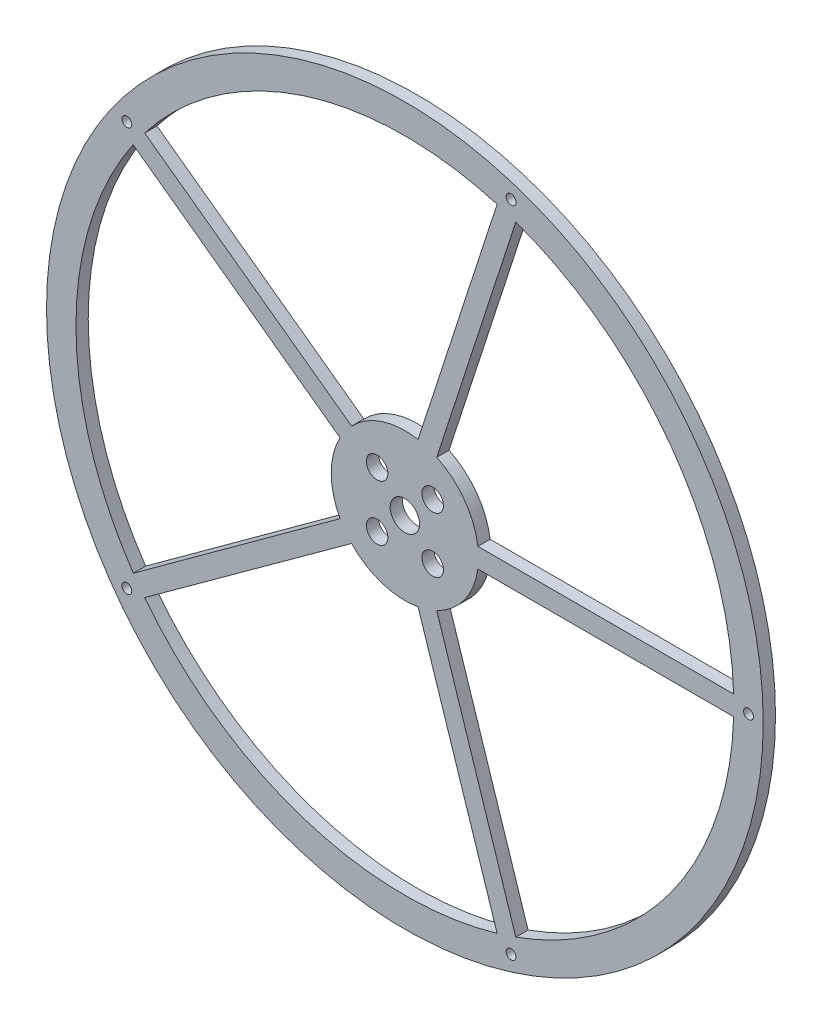
ISO-10303-21;
HEADER;
FILE_DESCRIPTION(('STEP AP214'),'2;1');
FILE_NAME('part.step','',(''),(''),'','','');
FILE_SCHEMA(('AUTOMOTIVE_DESIGN { 1 0 10303 214 1 1 1 1 }'));
ENDSEC;
DATA;
#1=APPLICATION_CONTEXT('core data for automotive mechanical design processes');
#2=APPLICATION_PROTOCOL_DEFINITION('international standard','automotive_design',2000,#1);
#3=PRODUCT_CONTEXT('',#1,'mechanical');
#4=PRODUCT('Part','Part','',(#3));
#5=PRODUCT_RELATED_PRODUCT_CATEGORY('part','',(#4));
#6=PRODUCT_DEFINITION_FORMATION('','',#4);
#7=PRODUCT_DEFINITION_CONTEXT('part definition',#1,'design');
#8=PRODUCT_DEFINITION('design','',#6,#7);
#9=PRODUCT_DEFINITION_SHAPE('','',#8);
#10=(LENGTH_UNIT() NAMED_UNIT(*) SI_UNIT(.MILLI.,.METRE.));
#11=(NAMED_UNIT(*) PLANE_ANGLE_UNIT() SI_UNIT($,.RADIAN.));
#12=(NAMED_UNIT(*) SI_UNIT($,.STERADIAN.) SOLID_ANGLE_UNIT());
#13=UNCERTAINTY_MEASURE_WITH_UNIT(LENGTH_MEASURE(1.E-05),#10,'distance_accuracy_value','');
#14=(GEOMETRIC_REPRESENTATION_CONTEXT(3) GLOBAL_UNCERTAINTY_ASSIGNED_CONTEXT((#13)) GLOBAL_UNIT_ASSIGNED_CONTEXT((#10,
#11,#12)) REPRESENTATION_CONTEXT('',''));
#15=CARTESIAN_POINT('',(0.,0.,0.));
#16=DIRECTION('',(0.,0.,1.));
#17=DIRECTION('',(1.,0.,0.));
#18=AXIS2_PLACEMENT_3D('',#15,#16,#17);
#19=CARTESIAN_POINT('',(0.,0.,0.));
#20=DIRECTION('',(0.,0.,1.));
#21=DIRECTION('',(1.,0.,0.));
#22=AXIS2_PLACEMENT_3D('',#19,#20,#21);
#23=CYLINDRICAL_SURFACE('',#22,67.);
#24=CARTESIAN_POINT('',(0.,0.,0.));
#25=DIRECTION('',(0.,0.,1.));
#26=DIRECTION('',(1.,0.,0.));
#27=AXIS2_PLACEMENT_3D('',#24,#25,#26);
#28=CIRCLE('',#27,67.);
#29=CARTESIAN_POINT('',(22.5970252120168,-63.0743565291591,0.));
#30=VERTEX_POINT('',#29);
#31=CARTESIAN_POINT('',(66.9701426010129,-2.,0.));
#32=VERTEX_POINT('',#31);
#33=EDGE_CURVE('E202',#30,#32,#28,.T.);
#34=ORIENTED_EDGE('',*,*,#33,.F.);
#35=DIRECTION('',(0.,0.,1.));
#36=VECTOR('',#35,1.);
#37=CARTESIAN_POINT('',(22.5970252120168,-63.0743565291591,0.));
#38=LINE('',#37,#36);
#39=CARTESIAN_POINT('',(22.5970252120168,-63.0743565291591,2.5));
#40=VERTEX_POINT('',#39);
#41=EDGE_CURVE('E195',#30,#40,#38,.T.);
#42=ORIENTED_EDGE('',*,*,#41,.T.);
#43=CARTESIAN_POINT('',(0.,0.,2.5));
#44=DIRECTION('',(0.,0.,1.));
#45=DIRECTION('',(1.,0.,0.));
#46=AXIS2_PLACEMENT_3D('',#43,#44,#45);
#47=CIRCLE('',#46,67.);
#48=CARTESIAN_POINT('',(66.9701426010129,-2.,2.5));
#49=VERTEX_POINT('',#48);
#50=EDGE_CURVE('E217',#40,#49,#47,.T.);
#51=ORIENTED_EDGE('',*,*,#50,.T.);
#52=DIRECTION('',(0.,0.,1.));
#53=VECTOR('',#52,1.);
#54=CARTESIAN_POINT('',(66.9701426010129,-2.,0.));
#55=LINE('',#54,#53);
#56=EDGE_CURVE('E212',#32,#49,#55,.T.);
#57=ORIENTED_EDGE('',*,*,#56,.F.);
#58=EDGE_LOOP('',(#34,#42,#51,#57));
#59=FACE_BOUND('',#58,.T.);
#60=ADVANCED_FACE('F39',(#59),#23,.F.);
#61=CARTESIAN_POINT('',(0.,0.,0.));
#62=DIRECTION('',(0.,0.,1.));
#63=DIRECTION('',(1.,0.,0.));
#64=AXIS2_PLACEMENT_3D('',#61,#62,#63);
#65=CYLINDRICAL_SURFACE('',#64,15.);
#66=DIRECTION('',(0.,0.,1.));
#67=VECTOR('',#66,1.);
#68=CARTESIAN_POINT('',(6.49598091505798,-13.5204375650791,0.));
#69=LINE('',#68,#67);
#70=CARTESIAN_POINT('',(6.49598091505798,-13.5204375650791,0.));
#71=VERTEX_POINT('',#70);
#72=CARTESIAN_POINT('',(6.49598091505798,-13.5204375650791,2.5));
#73=VERTEX_POINT('',#72);
#74=EDGE_CURVE('E369',#71,#73,#69,.T.);
#75=ORIENTED_EDGE('',*,*,#74,.F.);
#76=CARTESIAN_POINT('',(0.,0.,0.));
#77=DIRECTION('',(0.,0.,1.));
#78=DIRECTION('',(1.,0.,0.));
#79=AXIS2_PLACEMENT_3D('',#76,#77,#78);
#80=CIRCLE('',#79,15.);
#81=CARTESIAN_POINT('',(14.8660687473185,-2.,0.));
#82=VERTEX_POINT('',#81);
#83=EDGE_CURVE('E314',#71,#82,#80,.T.);
#84=ORIENTED_EDGE('',*,*,#83,.T.);
#85=DIRECTION('',(0.,0.,1.));
#86=VECTOR('',#85,1.);
#87=CARTESIAN_POINT('',(14.8660687473185,-2.,0.));
#88=LINE('',#87,#86);
#89=CARTESIAN_POINT('',(14.8660687473185,-2.,2.5));
#90=VERTEX_POINT('',#89);
#91=EDGE_CURVE('E11',#82,#90,#88,.T.);
#92=ORIENTED_EDGE('',*,*,#91,.T.);
#93=CARTESIAN_POINT('',(0.,0.,2.5));
#94=DIRECTION('',(0.,0.,1.));
#95=DIRECTION('',(1.,0.,0.));
#96=AXIS2_PLACEMENT_3D('',#93,#94,#95);
#97=CIRCLE('',#96,15.);
#98=EDGE_CURVE('E316',#73,#90,#97,.T.);
#99=ORIENTED_EDGE('',*,*,#98,.F.);
#100=EDGE_LOOP('',(#75,#84,#92,#99));
#101=FACE_BOUND('',#100,.T.);
#102=ADVANCED_FACE('F240',(#101),#65,.T.);
#103=CARTESIAN_POINT('',(-53.0044129753477,-40.9820961535498,2.5));
#104=VERTEX_POINT('',#103);
#105=CARTESIAN_POINT('',(18.7927991468362,-64.3104245066589,2.5));
#106=VERTEX_POINT('',#105);
#107=EDGE_CURVE('E194',#104,#106,#47,.T.);
#108=ORIENTED_EDGE('',*,*,#107,.T.);
#109=DIRECTION('',(0.,0.,1.));
#110=VECTOR('',#109,1.);
#111=CARTESIAN_POINT('',(18.7927991468362,-64.3104245066589,0.));
#112=LINE('',#111,#110);
#113=CARTESIAN_POINT('',(18.7927991468362,-64.3104245066589,0.));
#114=VERTEX_POINT('',#113);
#115=EDGE_CURVE('E179',#114,#106,#112,.T.);
#116=ORIENTED_EDGE('',*,*,#115,.F.);
#117=CARTESIAN_POINT('',(-53.0044129753477,-40.9820961535497,0.));
#118=VERTEX_POINT('',#117);
#119=EDGE_CURVE('E192',#118,#114,#28,.T.);
#120=ORIENTED_EDGE('',*,*,#119,.F.);
#121=DIRECTION('',(0.,0.,1.));
#122=VECTOR('',#121,1.);
#123=CARTESIAN_POINT('',(-53.0044129753477,-40.9820961535498,0.));
#124=LINE('',#123,#122);
#125=EDGE_CURVE('E361',#118,#104,#124,.T.);
#126=ORIENTED_EDGE('',*,*,#125,.T.);
#127=EDGE_LOOP('',(#108,#116,#120,#126));
#128=FACE_BOUND('',#127,.T.);
#129=ADVANCED_FACE('F190',(#128),#23,.F.);
#130=DIRECTION('',(0.,0.,1.));
#131=VECTOR('',#130,1.);
#132=CARTESIAN_POINT('',(2.69175484987736,-14.7565055425789,0.));
#133=LINE('',#132,#131);
#134=CARTESIAN_POINT('',(2.69175484987736,-14.7565055425789,2.5));
#135=VERTEX_POINT('',#134);
#136=CARTESIAN_POINT('',(2.69175484987736,-14.7565055425789,0.));
#137=VERTEX_POINT('',#136);
#138=EDGE_CURVE('E182',#135,#137,#133,.F.);
#139=ORIENTED_EDGE('',*,*,#138,.F.);
#140=CARTESIAN_POINT('',(-10.8513317515419,-10.3560899579899,2.5));
#141=VERTEX_POINT('',#140);
#142=EDGE_CURVE('E466',#141,#135,#97,.T.);
#143=ORIENTED_EDGE('',*,*,#142,.F.);
#144=DIRECTION('',(0.,0.,1.));
#145=VECTOR('',#144,1.);
#146=CARTESIAN_POINT('',(-10.8513317515419,-10.3560899579899,0.));
#147=LINE('',#146,#145);
#148=CARTESIAN_POINT('',(-10.8513317515419,-10.3560899579899,0.));
#149=VERTEX_POINT('',#148);
#150=EDGE_CURVE('E354',#149,#141,#147,.T.);
#151=ORIENTED_EDGE('',*,*,#150,.F.);
#152=EDGE_CURVE('E545',#149,#137,#80,.T.);
#153=ORIENTED_EDGE('',*,*,#152,.T.);
#154=EDGE_LOOP('',(#139,#143,#151,#153));
#155=FACE_BOUND('',#154,.T.);
#156=ADVANCED_FACE('F249',(#155),#65,.T.);
#157=CARTESIAN_POINT('',(-55.3555539845184,37.7460281760489,2.5));
#158=VERTEX_POINT('',#157);
#159=CARTESIAN_POINT('',(-55.3030418102858,-37.8229238231233,2.5));
#160=VERTEX_POINT('',#159);
#161=EDGE_CURVE('E283',#158,#160,#47,.T.);
#162=ORIENTED_EDGE('',*,*,#161,.T.);
#163=DIRECTION('',(0.,0.,1.));
#164=VECTOR('',#163,1.);
#165=CARTESIAN_POINT('',(-55.3030418102858,-37.8229238231233,0.));
#166=LINE('',#165,#164);
#167=CARTESIAN_POINT('',(-55.3030418102858,-37.8229238231233,0.));
#168=VERTEX_POINT('',#167);
#169=EDGE_CURVE('E286',#168,#160,#166,.T.);
#170=ORIENTED_EDGE('',*,*,#169,.F.);
#171=CARTESIAN_POINT('',(-55.3555539845183,37.7460281760489,0.));
#172=VERTEX_POINT('',#171);
#173=EDGE_CURVE('E201',#172,#168,#28,.T.);
#174=ORIENTED_EDGE('',*,*,#173,.F.);
#175=DIRECTION('',(0.,0.,1.));
#176=VECTOR('',#175,1.);
#177=CARTESIAN_POINT('',(-55.3555539845184,37.7460281760489,0.));
#178=LINE('',#177,#176);
#179=EDGE_CURVE('E288',#172,#158,#178,.T.);
#180=ORIENTED_EDGE('',*,*,#179,.T.);
#181=EDGE_LOOP('',(#162,#170,#174,#180));
#182=FACE_BOUND('',#181,.T.);
#183=ADVANCED_FACE('F254',(#182),#23,.F.);
#184=DIRECTION('',(0.,0.,1.));
#185=VECTOR('',#184,1.);
#186=CARTESIAN_POINT('',(-13.1925640172702,-7.13836498438031,0.));
#187=LINE('',#186,#185);
#188=CARTESIAN_POINT('',(-13.1925640172702,-7.13836498438031,2.5));
#189=VERTEX_POINT('',#188);
#190=CARTESIAN_POINT('',(-13.1925640172702,-7.13836498438031,0.));
#191=VERTEX_POINT('',#190);
#192=EDGE_CURVE('E359',#189,#191,#187,.F.);
#193=ORIENTED_EDGE('',*,*,#192,.F.);
#194=CARTESIAN_POINT('',(-13.202472760712,7.12002198048985,2.5));
#195=VERTEX_POINT('',#194);
#196=EDGE_CURVE('E470',#195,#189,#97,.T.);
#197=ORIENTED_EDGE('',*,*,#196,.F.);
#198=DIRECTION('',(0.,0.,1.));
#199=VECTOR('',#198,1.);
#200=CARTESIAN_POINT('',(-13.202472760712,7.12002198048985,0.));
#201=LINE('',#200,#199);
#202=CARTESIAN_POINT('',(-13.202472760712,7.12002198048985,0.));
#203=VERTEX_POINT('',#202);
#204=EDGE_CURVE('E337',#203,#195,#201,.T.);
#205=ORIENTED_EDGE('',*,*,#204,.F.);
#206=EDGE_CURVE('E543',#203,#191,#80,.T.);
#207=ORIENTED_EDGE('',*,*,#206,.T.);
#208=EDGE_LOOP('',(#193,#197,#205,#207));
#209=FACE_BOUND('',#208,.T.);
#210=ADVANCED_FACE('F265',(#209),#65,.T.);
#211=CARTESIAN_POINT('',(18.7927991468361,64.3104245066589,2.5));
#212=VERTEX_POINT('',#211);
#213=CARTESIAN_POINT('',(-53.0044129753482,40.9820961535491,2.5));
#214=VERTEX_POINT('',#213);
#215=EDGE_CURVE('E216',#212,#214,#47,.T.);
#216=ORIENTED_EDGE('',*,*,#215,.T.);
#217=DIRECTION('',(0.,0.,1.));
#218=VECTOR('',#217,1.);
#219=CARTESIAN_POINT('',(-53.0044129753482,40.9820961535491,0.));
#220=LINE('',#219,#218);
#221=CARTESIAN_POINT('',(-53.0044129753482,40.9820961535491,0.));
#222=VERTEX_POINT('',#221);
#223=EDGE_CURVE('E344',#222,#214,#220,.T.);
#224=ORIENTED_EDGE('',*,*,#223,.F.);
#225=CARTESIAN_POINT('',(18.7927991468361,64.3104245066589,0.));
#226=VERTEX_POINT('',#225);
#227=EDGE_CURVE('E205',#226,#222,#28,.T.);
#228=ORIENTED_EDGE('',*,*,#227,.F.);
#229=DIRECTION('',(0.,0.,1.));
#230=VECTOR('',#229,1.);
#231=CARTESIAN_POINT('',(18.7927991468361,64.3104245066589,0.));
#232=LINE('',#231,#230);
#233=EDGE_CURVE('E325',#226,#212,#232,.T.);
#234=ORIENTED_EDGE('',*,*,#233,.T.);
#235=EDGE_LOOP('',(#216,#224,#228,#234));
#236=FACE_BOUND('',#235,.T.);
#237=ADVANCED_FACE('F258',(#236),#23,.F.);
#238=DIRECTION('',(0.,0.,1.));
#239=VECTOR('',#238,1.);
#240=CARTESIAN_POINT('',(-10.851331751542,10.3560899579897,0.));
#241=LINE('',#240,#239);
#242=CARTESIAN_POINT('',(-10.851331751542,10.3560899579897,2.5));
#243=VERTEX_POINT('',#242);
#244=CARTESIAN_POINT('',(-10.851331751542,10.3560899579897,0.));
#245=VERTEX_POINT('',#244);
#246=EDGE_CURVE('E342',#243,#245,#241,.F.);
#247=ORIENTED_EDGE('',*,*,#246,.F.);
#248=CARTESIAN_POINT('',(2.69175484987735,14.7565055425789,2.5));
#249=VERTEX_POINT('',#248);
#250=EDGE_CURVE('E315',#249,#243,#97,.T.);
#251=ORIENTED_EDGE('',*,*,#250,.F.);
#252=DIRECTION('',(0.,0.,1.));
#253=VECTOR('',#252,1.);
#254=CARTESIAN_POINT('',(2.69175484987735,14.7565055425789,0.));
#255=LINE('',#254,#253);
#256=CARTESIAN_POINT('',(2.69175484987735,14.7565055425789,0.));
#257=VERTEX_POINT('',#256);
#258=EDGE_CURVE('E320',#257,#249,#255,.T.);
#259=ORIENTED_EDGE('',*,*,#258,.F.);
#260=EDGE_CURVE('E319',#257,#245,#80,.T.);
#261=ORIENTED_EDGE('',*,*,#260,.T.);
#262=EDGE_LOOP('',(#247,#251,#259,#261));
#263=FACE_BOUND('',#262,.T.);
#264=ADVANCED_FACE('F256',(#263),#65,.T.);
#265=CARTESIAN_POINT('',(66.9701426010129,2.,2.5));
#266=VERTEX_POINT('',#265);
#267=CARTESIAN_POINT('',(22.5970252120168,63.0743565291592,2.5));
#268=VERTEX_POINT('',#267);
#269=EDGE_CURVE('E206',#266,#268,#47,.T.);
#270=ORIENTED_EDGE('',*,*,#269,.T.);
#271=DIRECTION('',(0.,0.,1.));
#272=VECTOR('',#271,1.);
#273=CARTESIAN_POINT('',(22.5970252120168,63.0743565291592,0.));
#274=LINE('',#273,#272);
#275=CARTESIAN_POINT('',(22.5970252120168,63.0743565291592,0.));
#276=VERTEX_POINT('',#275);
#277=EDGE_CURVE('E326',#276,#268,#274,.T.);
#278=ORIENTED_EDGE('',*,*,#277,.F.);
#279=CARTESIAN_POINT('',(66.9701426010129,2.,0.));
#280=VERTEX_POINT('',#279);
#281=EDGE_CURVE('E207',#280,#276,#28,.T.);
#282=ORIENTED_EDGE('',*,*,#281,.F.);
#283=DIRECTION('',(0.,0.,1.));
#284=VECTOR('',#283,1.);
#285=CARTESIAN_POINT('',(66.9701426010129,2.,0.));
#286=LINE('',#285,#284);
#287=EDGE_CURVE('E290',#280,#266,#286,.T.);
#288=ORIENTED_EDGE('',*,*,#287,.T.);
#289=EDGE_LOOP('',(#270,#278,#282,#288));
#290=FACE_BOUND('',#289,.T.);
#291=ADVANCED_FACE('F243',(#290),#23,.F.);
#292=CARTESIAN_POINT('',(0.,0.,2.5));
#293=DIRECTION('',(0.,0.,-1.));
#294=DIRECTION('',(-1.,0.,0.));
#295=AXIS2_PLACEMENT_3D('',#292,#293,#294);
#296=CYLINDRICAL_SURFACE('',#295,73.);
#297=CARTESIAN_POINT('',(0.,0.,2.5));
#298=DIRECTION('',(0.,0.,1.));
#299=DIRECTION('',(1.,0.,0.));
#300=AXIS2_PLACEMENT_3D('',#297,#298,#299);
#301=CIRCLE('',#300,73.);
#302=CARTESIAN_POINT('',(73.,0.,2.5));
#303=VERTEX_POINT('',#302);
#304=EDGE_CURVE('E47',#303,#303,#301,.T.);
#305=ORIENTED_EDGE('',*,*,#304,.F.);
#306=EDGE_LOOP('',(#305));
#307=FACE_BOUND('',#306,.T.);
#308=CARTESIAN_POINT('',(0.,0.,0.));
#309=DIRECTION('',(0.,0.,1.));
#310=DIRECTION('',(1.,0.,0.));
#311=AXIS2_PLACEMENT_3D('',#308,#309,#310);
#312=CIRCLE('',#311,73.);
#313=CARTESIAN_POINT('',(73.,0.,0.));
#314=VERTEX_POINT('',#313);
#315=EDGE_CURVE('E211',#314,#314,#312,.T.);
#316=ORIENTED_EDGE('',*,*,#315,.T.);
#317=EDGE_LOOP('',(#316));
#318=FACE_BOUND('',#317,.T.);
#319=ADVANCED_FACE('F41',(#307,#318),#296,.T.);
#320=CARTESIAN_POINT('',(0.,0.,2.5));
#321=DIRECTION('',(0.,0.,1.));
#322=DIRECTION('',(1.,0.,0.));
#323=AXIS2_PLACEMENT_3D('',#320,#321,#322);
#324=PLANE('',#323);
#325=CARTESIAN_POINT('',(5.657,5.657,2.5));
#326=DIRECTION('',(0.,0.,1.));
#327=DIRECTION('',(1.,0.,0.));
#328=AXIS2_PLACEMENT_3D('',#325,#326,#327);
#329=CIRCLE('',#328,2.2);
#330=CARTESIAN_POINT('',(7.857,5.657,2.5));
#331=VERTEX_POINT('',#330);
#332=EDGE_CURVE('E434',#331,#331,#329,.T.);
#333=ORIENTED_EDGE('',*,*,#332,.F.);
#334=EDGE_LOOP('',(#333));
#335=FACE_BOUND('',#334,.T.);
#336=CARTESIAN_POINT('',(-5.657,-5.657,2.5));
#337=DIRECTION('',(0.,0.,1.));
#338=DIRECTION('',(1.,0.,0.));
#339=AXIS2_PLACEMENT_3D('',#336,#337,#338);
#340=CIRCLE('',#339,2.2);
#341=CARTESIAN_POINT('',(-3.457,-5.657,2.5));
#342=VERTEX_POINT('',#341);
#343=EDGE_CURVE('E431',#342,#342,#340,.T.);
#344=ORIENTED_EDGE('',*,*,#343,.F.);
#345=EDGE_LOOP('',(#344));
#346=FACE_BOUND('',#345,.T.);
#347=CARTESIAN_POINT('',(-5.657,5.657,2.5));
#348=DIRECTION('',(0.,0.,1.));
#349=DIRECTION('',(1.,0.,0.));
#350=AXIS2_PLACEMENT_3D('',#347,#348,#349);
#351=CIRCLE('',#350,2.2);
#352=CARTESIAN_POINT('',(-3.457,5.657,2.5));
#353=VERTEX_POINT('',#352);
#354=EDGE_CURVE('E419',#353,#353,#351,.T.);
#355=ORIENTED_EDGE('',*,*,#354,.F.);
#356=EDGE_LOOP('',(#355));
#357=FACE_BOUND('',#356,.T.);
#358=CARTESIAN_POINT('',(5.657,-5.657,2.5));
#359=DIRECTION('',(0.,0.,1.));
#360=DIRECTION('',(1.,0.,0.));
#361=AXIS2_PLACEMENT_3D('',#358,#359,#360);
#362=CIRCLE('',#361,2.2);
#363=CARTESIAN_POINT('',(7.857,-5.657,2.5));
#364=VERTEX_POINT('',#363);
#365=EDGE_CURVE('E413',#364,#364,#362,.T.);
#366=ORIENTED_EDGE('',*,*,#365,.F.);
#367=EDGE_LOOP('',(#366));
#368=FACE_BOUND('',#367,.T.);
#369=CARTESIAN_POINT('',(0.,0.,2.5));
#370=DIRECTION('',(0.,0.,1.));
#371=DIRECTION('',(1.,0.,0.));
#372=AXIS2_PLACEMENT_3D('',#369,#370,#371);
#373=CIRCLE('',#372,3.);
#374=CARTESIAN_POINT('',(3.,0.,2.5));
#375=VERTEX_POINT('',#374);
#376=EDGE_CURVE('E410',#375,#375,#373,.T.);
#377=ORIENTED_EDGE('',*,*,#376,.F.);
#378=EDGE_LOOP('',(#377));
#379=FACE_BOUND('',#378,.T.);
#380=CARTESIAN_POINT('',(70.,0.,2.5));
#381=DIRECTION('',(0.,0.,1.));
#382=DIRECTION('',(1.,0.,0.));
#383=AXIS2_PLACEMENT_3D('',#380,#381,#382);
#384=CIRCLE('',#383,0.999999999999998);
#385=CARTESIAN_POINT('',(71.,0.,2.5));
#386=VERTEX_POINT('',#385);
#387=EDGE_CURVE('E405',#386,#386,#384,.T.);
#388=ORIENTED_EDGE('',*,*,#387,.F.);
#389=EDGE_LOOP('',(#388));
#390=FACE_BOUND('',#389,.T.);
#391=CARTESIAN_POINT('',(21.6311896062461,66.5739561406608,2.5));
#392=DIRECTION('',(0.,0.,1.));
#393=DIRECTION('',(1.,0.,0.));
#394=AXIS2_PLACEMENT_3D('',#391,#392,#393);
#395=CIRCLE('',#394,1.);
#396=CARTESIAN_POINT('',(22.6311896062461,66.5739561406608,2.5));
#397=VERTEX_POINT('',#396);
#398=EDGE_CURVE('E402',#397,#397,#395,.T.);
#399=ORIENTED_EDGE('',*,*,#398,.F.);
#400=EDGE_LOOP('',(#399));
#401=FACE_BOUND('',#400,.T.);
#402=CARTESIAN_POINT('',(-56.6311896062466,41.1449676604728,2.5));
#403=DIRECTION('',(0.,0.,1.));
#404=DIRECTION('',(1.,0.,0.));
#405=AXIS2_PLACEMENT_3D('',#402,#403,#404);
#406=CIRCLE('',#405,0.999999999999998);
#407=CARTESIAN_POINT('',(-55.6311896062466,41.1449676604728,2.5));
#408=VERTEX_POINT('',#407);
#409=EDGE_CURVE('E396',#408,#408,#406,.T.);
#410=ORIENTED_EDGE('',*,*,#409,.F.);
#411=EDGE_LOOP('',(#410));
#412=FACE_BOUND('',#411,.T.);
#413=CARTESIAN_POINT('',(-56.6311896062466,-41.1449676604728,2.5));
#414=DIRECTION('',(0.,0.,1.));
#415=DIRECTION('',(1.,0.,0.));
#416=AXIS2_PLACEMENT_3D('',#413,#414,#415);
#417=CIRCLE('',#416,0.999999999999998);
#418=CARTESIAN_POINT('',(-55.6311896062466,-41.1449676604728,2.5));
#419=VERTEX_POINT('',#418);
#420=EDGE_CURVE('E390',#419,#419,#417,.T.);
#421=ORIENTED_EDGE('',*,*,#420,.F.);
#422=EDGE_LOOP('',(#421));
#423=FACE_BOUND('',#422,.T.);
#424=CARTESIAN_POINT('',(21.6311896062461,-66.5739561406608,2.5));
#425=DIRECTION('',(0.,0.,1.));
#426=DIRECTION('',(1.,0.,0.));
#427=AXIS2_PLACEMENT_3D('',#424,#425,#426);
#428=CIRCLE('',#427,1.);
#429=CARTESIAN_POINT('',(22.6311896062461,-66.5739561406608,2.5));
#430=VERTEX_POINT('',#429);
#431=EDGE_CURVE('E383',#430,#430,#428,.T.);
#432=ORIENTED_EDGE('',*,*,#431,.F.);
#433=EDGE_LOOP('',(#432));
#434=FACE_BOUND('',#433,.T.);
#435=DIRECTION('',(-0.309016994374945,0.951056516295154,0.));
#436=VECTOR('',#435,1.);
#437=CARTESIAN_POINT('',(1.90211303259031,0.61803398874989,2.5));
#438=LINE('',#437,#436);
#439=EDGE_CURVE('E54',#40,#73,#438,.T.);
#440=ORIENTED_EDGE('',*,*,#439,.T.);
#441=ORIENTED_EDGE('',*,*,#98,.T.);
#442=DIRECTION('',(1.,0.,0.));
#443=VECTOR('',#442,1.);
#444=CARTESIAN_POINT('',(0.,-2.,2.5));
#445=LINE('',#444,#443);
#446=EDGE_CURVE('E303',#90,#49,#445,.T.);
#447=ORIENTED_EDGE('',*,*,#446,.T.);
#448=ORIENTED_EDGE('',*,*,#50,.F.);
#449=EDGE_LOOP('',(#440,#441,#447,#448));
#450=FACE_BOUND('',#449,.T.);
#451=ORIENTED_EDGE('',*,*,#142,.T.);
#452=DIRECTION('',(0.309016994374945,-0.951056516295154,0.));
#453=VECTOR('',#452,1.);
#454=CARTESIAN_POINT('',(-1.90211303259031,-0.618033988749883,2.5));
#455=LINE('',#454,#453);
#456=EDGE_CURVE('E376',#135,#106,#455,.T.);
#457=ORIENTED_EDGE('',*,*,#456,.T.);
#458=ORIENTED_EDGE('',*,*,#107,.F.);
#459=DIRECTION('',(0.809016994374941,0.587785252292482,0.));
#460=VECTOR('',#459,1.);
#461=CARTESIAN_POINT('',(1.17557050458496,-1.61803398874988,2.5));
#462=LINE('',#461,#460);
#463=EDGE_CURVE('E364',#104,#141,#462,.T.);
#464=ORIENTED_EDGE('',*,*,#463,.T.);
#465=EDGE_LOOP('',(#451,#457,#458,#464));
#466=FACE_BOUND('',#465,.T.);
#467=ORIENTED_EDGE('',*,*,#196,.T.);
#468=DIRECTION('',(-0.808199337246578,-0.588909017823799,0.));
#469=VECTOR('',#468,1.);
#470=CARTESIAN_POINT('',(-1.175570504585,1.61803398874986,2.5));
#471=LINE('',#470,#469);
#472=EDGE_CURVE('E367',#189,#160,#471,.T.);
#473=ORIENTED_EDGE('',*,*,#472,.T.);
#474=ORIENTED_EDGE('',*,*,#161,.F.);
#475=DIRECTION('',(0.809016994374953,-0.587785252292466,0.));
#476=VECTOR('',#475,1.);
#477=CARTESIAN_POINT('',(-1.17557050458493,-1.61803398874991,2.5));
#478=LINE('',#477,#476);
#479=EDGE_CURVE('E349',#158,#195,#478,.T.);
#480=ORIENTED_EDGE('',*,*,#479,.T.);
#481=EDGE_LOOP('',(#467,#473,#474,#480));
#482=FACE_BOUND('',#481,.T.);
#483=ORIENTED_EDGE('',*,*,#250,.T.);
#484=DIRECTION('',(-0.809016994374949,0.587785252292471,0.));
#485=VECTOR('',#484,1.);
#486=CARTESIAN_POINT('',(1.17557050458494,1.6180339887499,2.5));
#487=LINE('',#486,#485);
#488=EDGE_CURVE('E352',#243,#214,#487,.T.);
#489=ORIENTED_EDGE('',*,*,#488,.T.);
#490=ORIENTED_EDGE('',*,*,#215,.F.);
#491=DIRECTION('',(-0.309016994374945,-0.951056516295155,0.));
#492=VECTOR('',#491,1.);
#493=CARTESIAN_POINT('',(-1.90211303259031,0.618033988749889,2.5));
#494=LINE('',#493,#492);
#495=EDGE_CURVE('E332',#212,#249,#494,.T.);
#496=ORIENTED_EDGE('',*,*,#495,.T.);
#497=EDGE_LOOP('',(#483,#489,#490,#496));
#498=FACE_BOUND('',#497,.T.);
#499=CARTESIAN_POINT('',(14.8660687473185,2.,2.5));
#500=VERTEX_POINT('',#499);
#501=CARTESIAN_POINT('',(6.49598091505797,13.5204375650791,2.5));
#502=VERTEX_POINT('',#501);
#503=EDGE_CURVE('E311',#500,#502,#97,.T.);
#504=ORIENTED_EDGE('',*,*,#503,.T.);
#505=DIRECTION('',(0.309016994374945,0.951056516295155,0.));
#506=VECTOR('',#505,1.);
#507=CARTESIAN_POINT('',(1.90211303259031,-0.618033988749889,2.5));
#508=LINE('',#507,#506);
#509=EDGE_CURVE('E335',#502,#268,#508,.T.);
#510=ORIENTED_EDGE('',*,*,#509,.T.);
#511=ORIENTED_EDGE('',*,*,#269,.F.);
#512=DIRECTION('',(1.,0.,0.));
#513=VECTOR('',#512,1.);
#514=CARTESIAN_POINT('',(0.,2.,2.5));
#515=LINE('',#514,#513);
#516=EDGE_CURVE('E300',#500,#266,#515,.T.);
#517=ORIENTED_EDGE('',*,*,#516,.F.);
#518=EDGE_LOOP('',(#504,#510,#511,#517));
#519=FACE_BOUND('',#518,.T.);
#520=ORIENTED_EDGE('',*,*,#304,.T.);
#521=EDGE_LOOP('',(#520));
#522=FACE_BOUND('',#521,.T.);
#523=ADVANCED_FACE('F225',(#335,#346,#357,#368,#379,#390,#401,#412,#423,#434,#450,#466,#482,
#498,#519,#522),#324,.T.);
#524=CARTESIAN_POINT('',(0.,0.,0.));
#525=DIRECTION('',(0.,0.,1.));
#526=DIRECTION('',(1.,0.,0.));
#527=AXIS2_PLACEMENT_3D('',#524,#525,#526);
#528=PLANE('',#527);
#529=CARTESIAN_POINT('',(5.657,5.657,0.));
#530=DIRECTION('',(0.,0.,1.));
#531=DIRECTION('',(1.,0.,0.));
#532=AXIS2_PLACEMENT_3D('',#529,#530,#531);
#533=CIRCLE('',#532,2.2);
#534=CARTESIAN_POINT('',(7.857,5.657,0.));
#535=VERTEX_POINT('',#534);
#536=EDGE_CURVE('E420',#535,#535,#533,.T.);
#537=ORIENTED_EDGE('',*,*,#536,.T.);
#538=EDGE_LOOP('',(#537));
#539=FACE_BOUND('',#538,.T.);
#540=CARTESIAN_POINT('',(-5.657,-5.657,0.));
#541=DIRECTION('',(0.,0.,1.));
#542=DIRECTION('',(1.,0.,0.));
#543=AXIS2_PLACEMENT_3D('',#540,#541,#542);
#544=CIRCLE('',#543,2.2);
#545=CARTESIAN_POINT('',(-3.457,-5.657,0.));
#546=VERTEX_POINT('',#545);
#547=EDGE_CURVE('E428',#546,#546,#544,.T.);
#548=ORIENTED_EDGE('',*,*,#547,.T.);
#549=EDGE_LOOP('',(#548));
#550=FACE_BOUND('',#549,.T.);
#551=CARTESIAN_POINT('',(-5.657,5.657,0.));
#552=DIRECTION('',(0.,0.,1.));
#553=DIRECTION('',(1.,0.,0.));
#554=AXIS2_PLACEMENT_3D('',#551,#552,#553);
#555=CIRCLE('',#554,2.2);
#556=CARTESIAN_POINT('',(-3.457,5.657,0.));
#557=VERTEX_POINT('',#556);
#558=EDGE_CURVE('E416',#557,#557,#555,.T.);
#559=ORIENTED_EDGE('',*,*,#558,.T.);
#560=EDGE_LOOP('',(#559));
#561=FACE_BOUND('',#560,.T.);
#562=CARTESIAN_POINT('',(5.657,-5.657,0.));
#563=DIRECTION('',(0.,0.,1.));
#564=DIRECTION('',(1.,0.,0.));
#565=AXIS2_PLACEMENT_3D('',#562,#563,#564);
#566=CIRCLE('',#565,2.2);
#567=CARTESIAN_POINT('',(7.857,-5.657,0.));
#568=VERTEX_POINT('',#567);
#569=EDGE_CURVE('E423',#568,#568,#566,.T.);
#570=ORIENTED_EDGE('',*,*,#569,.T.);
#571=EDGE_LOOP('',(#570));
#572=FACE_BOUND('',#571,.T.);
#573=CARTESIAN_POINT('',(0.,0.,0.));
#574=DIRECTION('',(0.,0.,1.));
#575=DIRECTION('',(1.,0.,0.));
#576=AXIS2_PLACEMENT_3D('',#573,#574,#575);
#577=CIRCLE('',#576,3.);
#578=CARTESIAN_POINT('',(3.,0.,0.));
#579=VERTEX_POINT('',#578);
#580=EDGE_CURVE('E384',#579,#579,#577,.T.);
#581=ORIENTED_EDGE('',*,*,#580,.T.);
#582=EDGE_LOOP('',(#581));
#583=FACE_BOUND('',#582,.T.);
#584=CARTESIAN_POINT('',(70.,0.,0.));
#585=DIRECTION('',(0.,0.,1.));
#586=DIRECTION('',(1.,0.,0.));
#587=AXIS2_PLACEMENT_3D('',#584,#585,#586);
#588=CIRCLE('',#587,0.999999999999998);
#589=CARTESIAN_POINT('',(71.,0.,0.));
#590=VERTEX_POINT('',#589);
#591=EDGE_CURVE('E378',#590,#590,#588,.T.);
#592=ORIENTED_EDGE('',*,*,#591,.T.);
#593=EDGE_LOOP('',(#592));
#594=FACE_BOUND('',#593,.T.);
#595=CARTESIAN_POINT('',(21.6311896062461,66.5739561406608,0.));
#596=DIRECTION('',(0.,0.,1.));
#597=DIRECTION('',(1.,0.,0.));
#598=AXIS2_PLACEMENT_3D('',#595,#596,#597);
#599=CIRCLE('',#598,1.);
#600=CARTESIAN_POINT('',(22.6311896062461,66.5739561406608,0.));
#601=VERTEX_POINT('',#600);
#602=EDGE_CURVE('E399',#601,#601,#599,.T.);
#603=ORIENTED_EDGE('',*,*,#602,.T.);
#604=EDGE_LOOP('',(#603));
#605=FACE_BOUND('',#604,.T.);
#606=CARTESIAN_POINT('',(-56.6311896062466,41.1449676604728,0.));
#607=DIRECTION('',(0.,0.,1.));
#608=DIRECTION('',(1.,0.,0.));
#609=AXIS2_PLACEMENT_3D('',#606,#607,#608);
#610=CIRCLE('',#609,0.999999999999998);
#611=CARTESIAN_POINT('',(-55.6311896062466,41.1449676604728,0.));
#612=VERTEX_POINT('',#611);
#613=EDGE_CURVE('E393',#612,#612,#610,.T.);
#614=ORIENTED_EDGE('',*,*,#613,.T.);
#615=EDGE_LOOP('',(#614));
#616=FACE_BOUND('',#615,.T.);
#617=CARTESIAN_POINT('',(-56.6311896062466,-41.1449676604728,0.));
#618=DIRECTION('',(0.,0.,1.));
#619=DIRECTION('',(1.,0.,0.));
#620=AXIS2_PLACEMENT_3D('',#617,#618,#619);
#621=CIRCLE('',#620,0.999999999999998);
#622=CARTESIAN_POINT('',(-55.6311896062466,-41.1449676604728,0.));
#623=VERTEX_POINT('',#622);
#624=EDGE_CURVE('E387',#623,#623,#621,.T.);
#625=ORIENTED_EDGE('',*,*,#624,.T.);
#626=EDGE_LOOP('',(#625));
#627=FACE_BOUND('',#626,.T.);
#628=CARTESIAN_POINT('',(21.6311896062461,-66.5739561406608,0.));
#629=DIRECTION('',(0.,0.,1.));
#630=DIRECTION('',(1.,0.,0.));
#631=AXIS2_PLACEMENT_3D('',#628,#629,#630);
#632=CIRCLE('',#631,1.);
#633=CARTESIAN_POINT('',(22.6311896062461,-66.5739561406608,0.));
#634=VERTEX_POINT('',#633);
#635=EDGE_CURVE('E380',#634,#634,#632,.T.);
#636=ORIENTED_EDGE('',*,*,#635,.T.);
#637=EDGE_LOOP('',(#636));
#638=FACE_BOUND('',#637,.T.);
#639=ORIENTED_EDGE('',*,*,#83,.F.);
#640=DIRECTION('',(-0.309016994374945,0.951056516295154,0.));
#641=VECTOR('',#640,1.);
#642=CARTESIAN_POINT('',(1.90211303259031,0.61803398874989,0.));
#643=LINE('',#642,#641);
#644=EDGE_CURVE('E62',#30,#71,#643,.T.);
#645=ORIENTED_EDGE('',*,*,#644,.F.);
#646=ORIENTED_EDGE('',*,*,#33,.T.);
#647=DIRECTION('',(1.,0.,0.));
#648=VECTOR('',#647,1.);
#649=CARTESIAN_POINT('',(0.,-2.,0.));
#650=LINE('',#649,#648);
#651=EDGE_CURVE('E302',#82,#32,#650,.T.);
#652=ORIENTED_EDGE('',*,*,#651,.F.);
#653=EDGE_LOOP('',(#639,#645,#646,#652));
#654=FACE_BOUND('',#653,.T.);
#655=DIRECTION('',(-0.808199337246578,-0.588909017823799,0.));
#656=VECTOR('',#655,1.);
#657=CARTESIAN_POINT('',(-1.175570504585,1.61803398874986,0.));
#658=LINE('',#657,#656);
#659=EDGE_CURVE('E366',#191,#168,#658,.T.);
#660=ORIENTED_EDGE('',*,*,#659,.F.);
#661=ORIENTED_EDGE('',*,*,#206,.F.);
#662=DIRECTION('',(0.809016994374953,-0.587785252292466,0.));
#663=VECTOR('',#662,1.);
#664=CARTESIAN_POINT('',(-1.17557050458493,-1.61803398874991,0.));
#665=LINE('',#664,#663);
#666=EDGE_CURVE('E347',#172,#203,#665,.T.);
#667=ORIENTED_EDGE('',*,*,#666,.F.);
#668=ORIENTED_EDGE('',*,*,#173,.T.);
#669=EDGE_LOOP('',(#660,#661,#667,#668));
#670=FACE_BOUND('',#669,.T.);
#671=DIRECTION('',(0.309016994374945,-0.951056516295154,0.));
#672=VECTOR('',#671,1.);
#673=CARTESIAN_POINT('',(-1.90211303259031,-0.618033988749883,0.));
#674=LINE('',#673,#672);
#675=EDGE_CURVE('E176',#137,#114,#674,.T.);
#676=ORIENTED_EDGE('',*,*,#675,.F.);
#677=ORIENTED_EDGE('',*,*,#152,.F.);
#678=DIRECTION('',(0.809016994374941,0.587785252292482,0.));
#679=VECTOR('',#678,1.);
#680=CARTESIAN_POINT('',(1.17557050458496,-1.61803398874988,0.));
#681=LINE('',#680,#679);
#682=EDGE_CURVE('E199',#118,#149,#681,.T.);
#683=ORIENTED_EDGE('',*,*,#682,.F.);
#684=ORIENTED_EDGE('',*,*,#119,.T.);
#685=EDGE_LOOP('',(#676,#677,#683,#684));
#686=FACE_BOUND('',#685,.T.);
#687=DIRECTION('',(-0.809016994374949,0.587785252292471,0.));
#688=VECTOR('',#687,1.);
#689=CARTESIAN_POINT('',(1.17557050458494,1.6180339887499,0.));
#690=LINE('',#689,#688);
#691=EDGE_CURVE('E351',#245,#222,#690,.T.);
#692=ORIENTED_EDGE('',*,*,#691,.F.);
#693=ORIENTED_EDGE('',*,*,#260,.F.);
#694=DIRECTION('',(-0.309016994374945,-0.951056516295155,0.));
#695=VECTOR('',#694,1.);
#696=CARTESIAN_POINT('',(-1.90211303259031,0.618033988749889,0.));
#697=LINE('',#696,#695);
#698=EDGE_CURVE('E329',#226,#257,#697,.T.);
#699=ORIENTED_EDGE('',*,*,#698,.F.);
#700=ORIENTED_EDGE('',*,*,#227,.T.);
#701=EDGE_LOOP('',(#692,#693,#699,#700));
#702=FACE_BOUND('',#701,.T.);
#703=DIRECTION('',(0.309016994374945,0.951056516295155,0.));
#704=VECTOR('',#703,1.);
#705=CARTESIAN_POINT('',(1.90211303259031,-0.618033988749889,0.));
#706=LINE('',#705,#704);
#707=CARTESIAN_POINT('',(6.49598091505797,13.5204375650791,0.));
#708=VERTEX_POINT('',#707);
#709=EDGE_CURVE('E334',#708,#276,#706,.T.);
#710=ORIENTED_EDGE('',*,*,#709,.F.);
#711=CARTESIAN_POINT('',(14.8660687473185,2.,0.));
#712=VERTEX_POINT('',#711);
#713=EDGE_CURVE('E310',#712,#708,#80,.T.);
#714=ORIENTED_EDGE('',*,*,#713,.F.);
#715=DIRECTION('',(1.,0.,0.));
#716=VECTOR('',#715,1.);
#717=CARTESIAN_POINT('',(0.,2.,0.));
#718=LINE('',#717,#716);
#719=EDGE_CURVE('E298',#712,#280,#718,.T.);
#720=ORIENTED_EDGE('',*,*,#719,.T.);
#721=ORIENTED_EDGE('',*,*,#281,.T.);
#722=EDGE_LOOP('',(#710,#714,#720,#721));
#723=FACE_BOUND('',#722,.T.);
#724=ORIENTED_EDGE('',*,*,#315,.F.);
#725=EDGE_LOOP('',(#724));
#726=FACE_BOUND('',#725,.T.);
#727=ADVANCED_FACE('F197',(#539,#550,#561,#572,#583,#594,#605,#616,#627,#638,#654,#670,#686,
#702,#723,#726),#528,.F.);
#728=CARTESIAN_POINT('',(0.,2.,0.));
#729=DIRECTION('',(0.,-1.,0.));
#730=DIRECTION('',(0.,0.,-1.));
#731=AXIS2_PLACEMENT_3D('',#728,#729,#730);
#732=PLANE('',#731);
#733=ORIENTED_EDGE('',*,*,#719,.F.);
#734=DIRECTION('',(0.,0.,1.));
#735=VECTOR('',#734,1.);
#736=CARTESIAN_POINT('',(14.8660687473185,2.,0.));
#737=LINE('',#736,#735);
#738=EDGE_CURVE('E305',#712,#500,#737,.T.);
#739=ORIENTED_EDGE('',*,*,#738,.T.);
#740=ORIENTED_EDGE('',*,*,#516,.T.);
#741=ORIENTED_EDGE('',*,*,#287,.F.);
#742=EDGE_LOOP('',(#733,#739,#740,#741));
#743=FACE_BOUND('',#742,.T.);
#744=ADVANCED_FACE('F224',(#743),#732,.F.);
#745=CARTESIAN_POINT('',(0.,-2.,0.));
#746=DIRECTION('',(0.,-1.,0.));
#747=DIRECTION('',(0.,0.,-1.));
#748=AXIS2_PLACEMENT_3D('',#745,#746,#747);
#749=PLANE('',#748);
#750=ORIENTED_EDGE('',*,*,#91,.F.);
#751=ORIENTED_EDGE('',*,*,#651,.T.);
#752=ORIENTED_EDGE('',*,*,#56,.T.);
#753=ORIENTED_EDGE('',*,*,#446,.F.);
#754=EDGE_LOOP('',(#750,#751,#752,#753));
#755=FACE_BOUND('',#754,.T.);
#756=ADVANCED_FACE('F232',(#755),#749,.T.);
#757=DIRECTION('',(0.,0.,1.));
#758=VECTOR('',#757,1.);
#759=CARTESIAN_POINT('',(6.49598091505797,13.5204375650791,0.));
#760=LINE('',#759,#758);
#761=EDGE_CURVE('E323',#502,#708,#760,.F.);
#762=ORIENTED_EDGE('',*,*,#761,.F.);
#763=ORIENTED_EDGE('',*,*,#503,.F.);
#764=ORIENTED_EDGE('',*,*,#738,.F.);
#765=ORIENTED_EDGE('',*,*,#713,.T.);
#766=EDGE_LOOP('',(#762,#763,#764,#765));
#767=FACE_BOUND('',#766,.T.);
#768=ADVANCED_FACE('F250',(#767),#65,.T.);
#769=CARTESIAN_POINT('',(-1.90211303259031,0.618033988749889,0.));
#770=DIRECTION('',(-0.951056516295155,0.309016994374945,0.));
#771=DIRECTION('',(-0.309016994374945,-0.951056516295155,0.));
#772=AXIS2_PLACEMENT_3D('',#769,#770,#771);
#773=PLANE('',#772);
#774=ORIENTED_EDGE('',*,*,#698,.T.);
#775=ORIENTED_EDGE('',*,*,#258,.T.);
#776=ORIENTED_EDGE('',*,*,#495,.F.);
#777=ORIENTED_EDGE('',*,*,#233,.F.);
#778=EDGE_LOOP('',(#774,#775,#776,#777));
#779=FACE_BOUND('',#778,.T.);
#780=ADVANCED_FACE('F490',(#779),#773,.T.);
#781=CARTESIAN_POINT('',(1.90211303259031,-0.618033988749889,0.));
#782=DIRECTION('',(0.951056516295155,-0.309016994374945,0.));
#783=DIRECTION('',(0.309016994374945,0.951056516295155,0.));
#784=AXIS2_PLACEMENT_3D('',#781,#782,#783);
#785=PLANE('',#784);
#786=ORIENTED_EDGE('',*,*,#509,.F.);
#787=ORIENTED_EDGE('',*,*,#761,.T.);
#788=ORIENTED_EDGE('',*,*,#709,.T.);
#789=ORIENTED_EDGE('',*,*,#277,.T.);
#790=EDGE_LOOP('',(#786,#787,#788,#789));
#791=FACE_BOUND('',#790,.T.);
#792=ADVANCED_FACE('F485',(#791),#785,.T.);
#793=CARTESIAN_POINT('',(-1.17557050458493,-1.61803398874991,0.));
#794=DIRECTION('',(-0.587785252292466,-0.809016994374953,0.));
#795=DIRECTION('',(0.809016994374953,-0.587785252292466,0.));
#796=AXIS2_PLACEMENT_3D('',#793,#794,#795);
#797=PLANE('',#796);
#798=ORIENTED_EDGE('',*,*,#666,.T.);
#799=ORIENTED_EDGE('',*,*,#204,.T.);
#800=ORIENTED_EDGE('',*,*,#479,.F.);
#801=ORIENTED_EDGE('',*,*,#179,.F.);
#802=EDGE_LOOP('',(#798,#799,#800,#801));
#803=FACE_BOUND('',#802,.T.);
#804=ADVANCED_FACE('F489',(#803),#797,.T.);
#805=CARTESIAN_POINT('',(1.17557050458494,1.6180339887499,0.));
#806=DIRECTION('',(0.587785252292471,0.809016994374949,0.));
#807=DIRECTION('',(-0.809016994374949,0.587785252292471,0.));
#808=AXIS2_PLACEMENT_3D('',#805,#806,#807);
#809=PLANE('',#808);
#810=ORIENTED_EDGE('',*,*,#488,.F.);
#811=ORIENTED_EDGE('',*,*,#246,.T.);
#812=ORIENTED_EDGE('',*,*,#691,.T.);
#813=ORIENTED_EDGE('',*,*,#223,.T.);
#814=EDGE_LOOP('',(#810,#811,#812,#813));
#815=FACE_BOUND('',#814,.T.);
#816=ADVANCED_FACE('F496',(#815),#809,.T.);
#817=CARTESIAN_POINT('',(1.17557050458496,-1.61803398874988,0.));
#818=DIRECTION('',(0.587785252292482,-0.809016994374941,0.));
#819=DIRECTION('',(0.809016994374941,0.587785252292482,0.));
#820=AXIS2_PLACEMENT_3D('',#817,#818,#819);
#821=PLANE('',#820);
#822=ORIENTED_EDGE('',*,*,#682,.T.);
#823=ORIENTED_EDGE('',*,*,#150,.T.);
#824=ORIENTED_EDGE('',*,*,#463,.F.);
#825=ORIENTED_EDGE('',*,*,#125,.F.);
#826=EDGE_LOOP('',(#822,#823,#824,#825));
#827=FACE_BOUND('',#826,.T.);
#828=ADVANCED_FACE('F524',(#827),#821,.T.);
#829=CARTESIAN_POINT('',(-1.175570504585,1.61803398874986,0.));
#830=DIRECTION('',(-0.588909017823799,0.808199337246578,0.));
#831=DIRECTION('',(-0.808199337246578,-0.588909017823799,0.));
#832=AXIS2_PLACEMENT_3D('',#829,#830,#831);
#833=PLANE('',#832);
#834=ORIENTED_EDGE('',*,*,#472,.F.);
#835=ORIENTED_EDGE('',*,*,#192,.T.);
#836=ORIENTED_EDGE('',*,*,#659,.T.);
#837=ORIENTED_EDGE('',*,*,#169,.T.);
#838=EDGE_LOOP('',(#834,#835,#836,#837));
#839=FACE_BOUND('',#838,.T.);
#840=ADVANCED_FACE('F516',(#839),#833,.T.);
#841=CARTESIAN_POINT('',(1.90211303259031,0.61803398874989,0.));
#842=DIRECTION('',(0.951056516295154,0.309016994374945,0.));
#843=DIRECTION('',(-0.309016994374945,0.951056516295154,0.));
#844=AXIS2_PLACEMENT_3D('',#841,#842,#843);
#845=PLANE('',#844);
#846=ORIENTED_EDGE('',*,*,#644,.T.);
#847=ORIENTED_EDGE('',*,*,#74,.T.);
#848=ORIENTED_EDGE('',*,*,#439,.F.);
#849=ORIENTED_EDGE('',*,*,#41,.F.);
#850=EDGE_LOOP('',(#846,#847,#848,#849));
#851=FACE_BOUND('',#850,.T.);
#852=ADVANCED_FACE('F514',(#851),#845,.T.);
#853=CARTESIAN_POINT('',(-1.90211303259031,-0.618033988749883,0.));
#854=DIRECTION('',(-0.951056516295155,-0.309016994374945,0.));
#855=DIRECTION('',(0.309016994374945,-0.951056516295155,0.));
#856=AXIS2_PLACEMENT_3D('',#853,#854,#855);
#857=PLANE('',#856);
#858=ORIENTED_EDGE('',*,*,#456,.F.);
#859=ORIENTED_EDGE('',*,*,#138,.T.);
#860=ORIENTED_EDGE('',*,*,#675,.T.);
#861=ORIENTED_EDGE('',*,*,#115,.T.);
#862=EDGE_LOOP('',(#858,#859,#860,#861));
#863=FACE_BOUND('',#862,.T.);
#864=ADVANCED_FACE('F178',(#863),#857,.T.);
#865=CARTESIAN_POINT('',(21.6311896062461,-66.5739561406608,0.));
#866=DIRECTION('',(0.,0.,1.));
#867=DIRECTION('',(1.,0.,0.));
#868=AXIS2_PLACEMENT_3D('',#865,#866,#867);
#869=CYLINDRICAL_SURFACE('',#868,1.);
#870=ORIENTED_EDGE('',*,*,#635,.F.);
#871=EDGE_LOOP('',(#870));
#872=FACE_BOUND('',#871,.T.);
#873=ORIENTED_EDGE('',*,*,#431,.T.);
#874=EDGE_LOOP('',(#873));
#875=FACE_BOUND('',#874,.T.);
#876=ADVANCED_FACE('F522',(#872,#875),#869,.F.);
#877=CARTESIAN_POINT('',(-56.6311896062466,-41.1449676604728,0.));
#878=DIRECTION('',(0.,0.,1.));
#879=DIRECTION('',(1.,0.,0.));
#880=AXIS2_PLACEMENT_3D('',#877,#878,#879);
#881=CYLINDRICAL_SURFACE('',#880,0.999999999999998);
#882=ORIENTED_EDGE('',*,*,#624,.F.);
#883=EDGE_LOOP('',(#882));
#884=FACE_BOUND('',#883,.T.);
#885=ORIENTED_EDGE('',*,*,#420,.T.);
#886=EDGE_LOOP('',(#885));
#887=FACE_BOUND('',#886,.T.);
#888=ADVANCED_FACE('F614',(#884,#887),#881,.F.);
#889=CARTESIAN_POINT('',(-56.6311896062466,41.1449676604728,0.));
#890=DIRECTION('',(0.,0.,1.));
#891=DIRECTION('',(1.,0.,0.));
#892=AXIS2_PLACEMENT_3D('',#889,#890,#891);
#893=CYLINDRICAL_SURFACE('',#892,0.999999999999998);
#894=ORIENTED_EDGE('',*,*,#613,.F.);
#895=EDGE_LOOP('',(#894));
#896=FACE_BOUND('',#895,.T.);
#897=ORIENTED_EDGE('',*,*,#409,.T.);
#898=EDGE_LOOP('',(#897));
#899=FACE_BOUND('',#898,.T.);
#900=ADVANCED_FACE('F624',(#896,#899),#893,.F.);
#901=CARTESIAN_POINT('',(21.6311896062461,66.5739561406608,0.));
#902=DIRECTION('',(0.,0.,1.));
#903=DIRECTION('',(1.,0.,0.));
#904=AXIS2_PLACEMENT_3D('',#901,#902,#903);
#905=CYLINDRICAL_SURFACE('',#904,1.);
#906=ORIENTED_EDGE('',*,*,#602,.F.);
#907=EDGE_LOOP('',(#906));
#908=FACE_BOUND('',#907,.T.);
#909=ORIENTED_EDGE('',*,*,#398,.T.);
#910=EDGE_LOOP('',(#909));
#911=FACE_BOUND('',#910,.T.);
#912=ADVANCED_FACE('F634',(#908,#911),#905,.F.);
#913=CARTESIAN_POINT('',(70.,0.,0.));
#914=DIRECTION('',(0.,0.,1.));
#915=DIRECTION('',(1.,0.,0.));
#916=AXIS2_PLACEMENT_3D('',#913,#914,#915);
#917=CYLINDRICAL_SURFACE('',#916,0.999999999999998);
#918=ORIENTED_EDGE('',*,*,#591,.F.);
#919=EDGE_LOOP('',(#918));
#920=FACE_BOUND('',#919,.T.);
#921=ORIENTED_EDGE('',*,*,#387,.T.);
#922=EDGE_LOOP('',(#921));
#923=FACE_BOUND('',#922,.T.);
#924=ADVANCED_FACE('F645',(#920,#923),#917,.F.);
#925=CARTESIAN_POINT('',(0.,0.,0.));
#926=DIRECTION('',(0.,0.,1.));
#927=DIRECTION('',(1.,0.,0.));
#928=AXIS2_PLACEMENT_3D('',#925,#926,#927);
#929=CYLINDRICAL_SURFACE('',#928,3.);
#930=ORIENTED_EDGE('',*,*,#580,.F.);
#931=EDGE_LOOP('',(#930));
#932=FACE_BOUND('',#931,.T.);
#933=ORIENTED_EDGE('',*,*,#376,.T.);
#934=EDGE_LOOP('',(#933));
#935=FACE_BOUND('',#934,.T.);
#936=ADVANCED_FACE('F656',(#932,#935),#929,.F.);
#937=CARTESIAN_POINT('',(5.657,-5.657,0.));
#938=DIRECTION('',(0.,0.,1.));
#939=DIRECTION('',(1.,0.,0.));
#940=AXIS2_PLACEMENT_3D('',#937,#938,#939);
#941=CYLINDRICAL_SURFACE('',#940,2.2);
#942=ORIENTED_EDGE('',*,*,#569,.F.);
#943=EDGE_LOOP('',(#942));
#944=FACE_BOUND('',#943,.T.);
#945=ORIENTED_EDGE('',*,*,#365,.T.);
#946=EDGE_LOOP('',(#945));
#947=FACE_BOUND('',#946,.T.);
#948=ADVANCED_FACE('F667',(#944,#947),#941,.F.);
#949=CARTESIAN_POINT('',(-5.657,5.657,0.));
#950=DIRECTION('',(0.,0.,1.));
#951=DIRECTION('',(1.,0.,0.));
#952=AXIS2_PLACEMENT_3D('',#949,#950,#951);
#953=CYLINDRICAL_SURFACE('',#952,2.2);
#954=ORIENTED_EDGE('',*,*,#558,.F.);
#955=EDGE_LOOP('',(#954));
#956=FACE_BOUND('',#955,.T.);
#957=ORIENTED_EDGE('',*,*,#354,.T.);
#958=EDGE_LOOP('',(#957));
#959=FACE_BOUND('',#958,.T.);
#960=ADVANCED_FACE('F679',(#956,#959),#953,.F.);
#961=CARTESIAN_POINT('',(-5.657,-5.657,0.));
#962=DIRECTION('',(0.,0.,1.));
#963=DIRECTION('',(1.,0.,0.));
#964=AXIS2_PLACEMENT_3D('',#961,#962,#963);
#965=CYLINDRICAL_SURFACE('',#964,2.2);
#966=ORIENTED_EDGE('',*,*,#547,.F.);
#967=EDGE_LOOP('',(#966));
#968=FACE_BOUND('',#967,.T.);
#969=ORIENTED_EDGE('',*,*,#343,.T.);
#970=EDGE_LOOP('',(#969));
#971=FACE_BOUND('',#970,.T.);
#972=ADVANCED_FACE('F442',(#968,#971),#965,.F.);
#973=CARTESIAN_POINT('',(5.657,5.657,0.));
#974=DIRECTION('',(0.,0.,1.));
#975=DIRECTION('',(1.,0.,0.));
#976=AXIS2_PLACEMENT_3D('',#973,#974,#975);
#977=CYLINDRICAL_SURFACE('',#976,2.2);
#978=ORIENTED_EDGE('',*,*,#536,.F.);
#979=EDGE_LOOP('',(#978));
#980=FACE_BOUND('',#979,.T.);
#981=ORIENTED_EDGE('',*,*,#332,.T.);
#982=EDGE_LOOP('',(#981));
#983=FACE_BOUND('',#982,.T.);
#984=ADVANCED_FACE('F439',(#980,#983),#977,.F.);
#985=CLOSED_SHELL('',(#60,#102,#129,#156,#183,#210,#237,#264,#291,#319,#523,#727,#744,#756,#768,
#780,#792,#804,#816,#828,#840,#852,#864,#876,#888,#900,#912,#924,#936,#948,#960,#972,#984));
#986=MANIFOLD_SOLID_BREP('B2',#985);
#987=ADVANCED_BREP_SHAPE_REPRESENTATION('',(#18,#986),#14);
#988=SHAPE_DEFINITION_REPRESENTATION(#9,#987);
ENDSEC;
END-ISO-10303-21;
